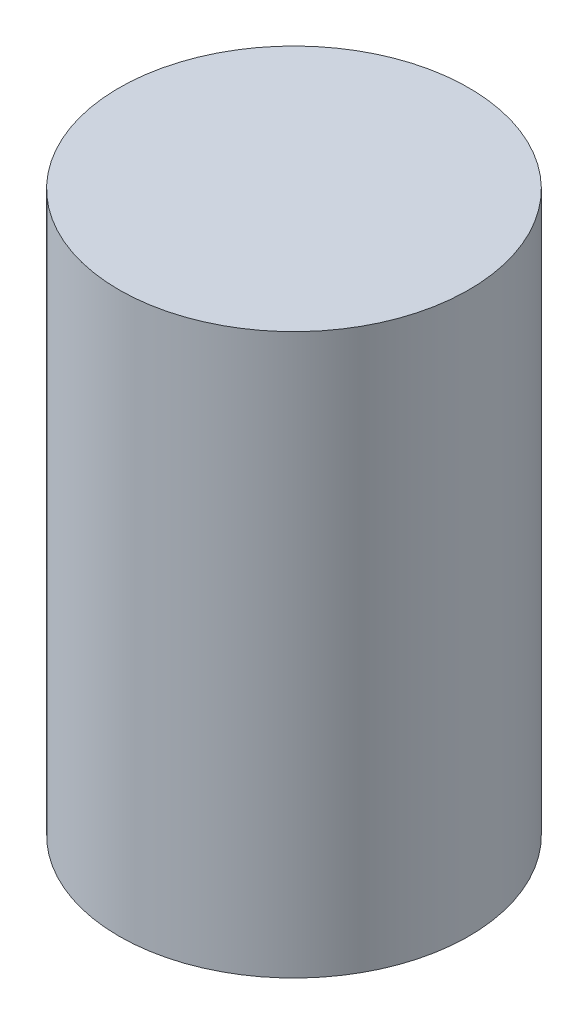
ISO-10303-21;
HEADER;
FILE_DESCRIPTION(('STEP AP214'),'2;1');
FILE_NAME('part.step','',(''),(''),'','','');
FILE_SCHEMA(('AUTOMOTIVE_DESIGN { 1 0 10303 214 1 1 1 1 }'));
ENDSEC;
DATA;
#1=APPLICATION_CONTEXT('core data for automotive mechanical design processes');
#2=APPLICATION_PROTOCOL_DEFINITION('international standard','automotive_design',2000,#1);
#3=PRODUCT_CONTEXT('',#1,'mechanical');
#4=PRODUCT('Part','Part','',(#3));
#5=PRODUCT_RELATED_PRODUCT_CATEGORY('part','',(#4));
#6=PRODUCT_DEFINITION_FORMATION('','',#4);
#7=PRODUCT_DEFINITION_CONTEXT('part definition',#1,'design');
#8=PRODUCT_DEFINITION('design','',#6,#7);
#9=PRODUCT_DEFINITION_SHAPE('','',#8);
#10=(LENGTH_UNIT() NAMED_UNIT(*) SI_UNIT(.MILLI.,.METRE.));
#11=(NAMED_UNIT(*) PLANE_ANGLE_UNIT() SI_UNIT($,.RADIAN.));
#12=(NAMED_UNIT(*) SI_UNIT($,.STERADIAN.) SOLID_ANGLE_UNIT());
#13=UNCERTAINTY_MEASURE_WITH_UNIT(LENGTH_MEASURE(1.E-05),#10,'distance_accuracy_value','');
#14=(GEOMETRIC_REPRESENTATION_CONTEXT(3) GLOBAL_UNCERTAINTY_ASSIGNED_CONTEXT((#13)) GLOBAL_UNIT_ASSIGNED_CONTEXT((#10,
#11,#12)) REPRESENTATION_CONTEXT('',''));
#15=CARTESIAN_POINT('',(0.,0.,0.));
#16=DIRECTION('',(0.,0.,1.));
#17=DIRECTION('',(1.,0.,0.));
#18=AXIS2_PLACEMENT_3D('',#15,#16,#17);
#19=CARTESIAN_POINT('',(0.,40.,0.));
#20=DIRECTION('',(0.,-1.,0.));
#21=DIRECTION('',(0.,0.,-1.));
#22=AXIS2_PLACEMENT_3D('',#19,#20,#21);
#23=CYLINDRICAL_SURFACE('',#22,12.5);
#24=CARTESIAN_POINT('',(0.,40.,0.));
#25=DIRECTION('',(0.,1.,0.));
#26=DIRECTION('',(0.,0.,1.));
#27=AXIS2_PLACEMENT_3D('',#24,#25,#26);
#28=CIRCLE('',#27,12.5);
#29=CARTESIAN_POINT('',(0.,40.,12.5));
#30=VERTEX_POINT('',#29);
#31=EDGE_CURVE('E10',#30,#30,#28,.T.);
#32=ORIENTED_EDGE('',*,*,#31,.F.);
#33=EDGE_LOOP('',(#32));
#34=FACE_BOUND('',#33,.T.);
#35=CARTESIAN_POINT('',(0.,0.,0.));
#36=DIRECTION('',(0.,1.,0.));
#37=DIRECTION('',(0.,0.,1.));
#38=AXIS2_PLACEMENT_3D('',#35,#36,#37);
#39=CIRCLE('',#38,12.5);
#40=CARTESIAN_POINT('',(0.,0.,12.5));
#41=VERTEX_POINT('',#40);
#42=EDGE_CURVE('E32',#41,#41,#39,.T.);
#43=ORIENTED_EDGE('',*,*,#42,.T.);
#44=EDGE_LOOP('',(#43));
#45=FACE_BOUND('',#44,.T.);
#46=ADVANCED_FACE('F29',(#34,#45),#23,.T.);
#47=CARTESIAN_POINT('',(0.,40.,0.));
#48=DIRECTION('',(0.,1.,0.));
#49=DIRECTION('',(0.,0.,1.));
#50=AXIS2_PLACEMENT_3D('',#47,#48,#49);
#51=PLANE('',#50);
#52=ORIENTED_EDGE('',*,*,#31,.T.);
#53=EDGE_LOOP('',(#52));
#54=FACE_BOUND('',#53,.T.);
#55=ADVANCED_FACE('F44',(#54),#51,.T.);
#56=CARTESIAN_POINT('',(0.,0.,0.));
#57=DIRECTION('',(0.,1.,0.));
#58=DIRECTION('',(0.,0.,1.));
#59=AXIS2_PLACEMENT_3D('',#56,#57,#58);
#60=PLANE('',#59);
#61=ORIENTED_EDGE('',*,*,#42,.F.);
#62=EDGE_LOOP('',(#61));
#63=FACE_BOUND('',#62,.T.);
#64=ADVANCED_FACE('F42',(#63),#60,.F.);
#65=CLOSED_SHELL('',(#46,#55,#64));
#66=MANIFOLD_SOLID_BREP('B2',#65);
#67=ADVANCED_BREP_SHAPE_REPRESENTATION('',(#18,#66),#14);
#68=SHAPE_DEFINITION_REPRESENTATION(#9,#67);
ENDSEC;
END-ISO-10303-21;
